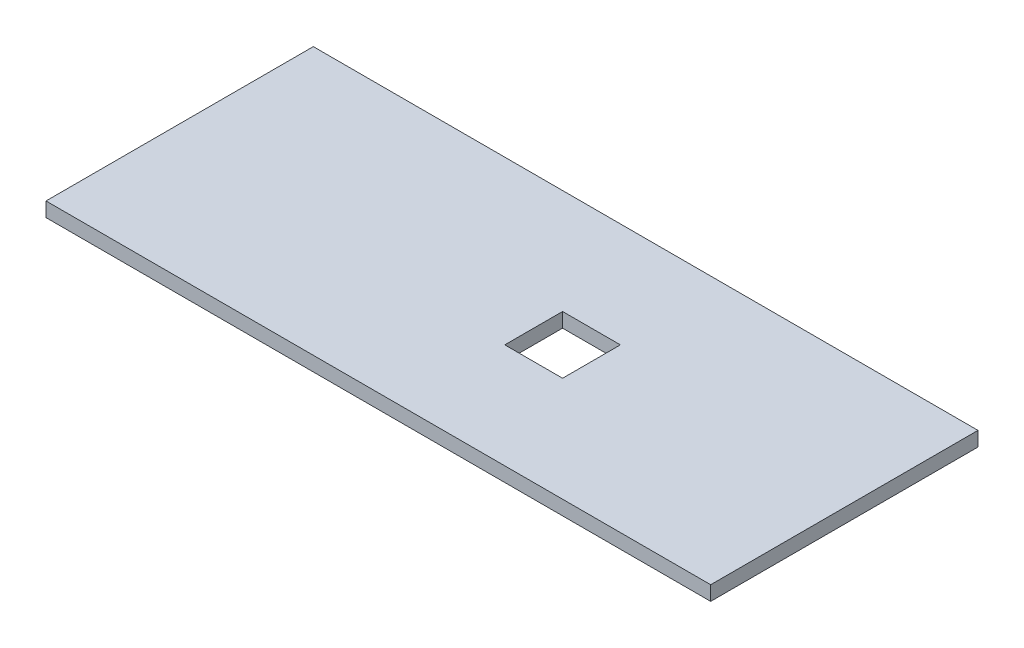
ISO-10303-21;
HEADER;
FILE_DESCRIPTION(('STEP AP214'),'2;1');
FILE_NAME('part.step','',(''),(''),'','','');
FILE_SCHEMA(('AUTOMOTIVE_DESIGN { 1 0 10303 214 1 1 1 1 }'));
ENDSEC;
DATA;
#1=APPLICATION_CONTEXT('core data for automotive mechanical design processes');
#2=APPLICATION_PROTOCOL_DEFINITION('international standard','automotive_design',2000,#1);
#3=PRODUCT_CONTEXT('',#1,'mechanical');
#4=PRODUCT('Part','Part','',(#3));
#5=PRODUCT_RELATED_PRODUCT_CATEGORY('part','',(#4));
#6=PRODUCT_DEFINITION_FORMATION('','',#4);
#7=PRODUCT_DEFINITION_CONTEXT('part definition',#1,'design');
#8=PRODUCT_DEFINITION('design','',#6,#7);
#9=PRODUCT_DEFINITION_SHAPE('','',#8);
#10=(LENGTH_UNIT() NAMED_UNIT(*) SI_UNIT(.MILLI.,.METRE.));
#11=(NAMED_UNIT(*) PLANE_ANGLE_UNIT() SI_UNIT($,.RADIAN.));
#12=(NAMED_UNIT(*) SI_UNIT($,.STERADIAN.) SOLID_ANGLE_UNIT());
#13=UNCERTAINTY_MEASURE_WITH_UNIT(LENGTH_MEASURE(1.E-05),#10,'distance_accuracy_value','');
#14=(GEOMETRIC_REPRESENTATION_CONTEXT(3) GLOBAL_UNCERTAINTY_ASSIGNED_CONTEXT((#13)) GLOBAL_UNIT_ASSIGNED_CONTEXT((#10,
#11,#12)) REPRESENTATION_CONTEXT('',''));
#15=CARTESIAN_POINT('',(0.,0.,0.));
#16=DIRECTION('',(0.,0.,1.));
#17=DIRECTION('',(1.,0.,0.));
#18=AXIS2_PLACEMENT_3D('',#15,#16,#17);
#19=CARTESIAN_POINT('',(0.,0.,74.));
#20=DIRECTION('',(0.,1.,0.));
#21=DIRECTION('',(-1.,0.,0.));
#22=AXIS2_PLACEMENT_3D('',#19,#20,#21);
#23=PLANE('',#22);
#24=DIRECTION('',(0.,0.,1.));
#25=VECTOR('',#24,1.);
#26=CARTESIAN_POINT('',(-86.,0.,74.));
#27=LINE('',#26,#25);
#28=CARTESIAN_POINT('',(-86.,0.,29.));
#29=VERTEX_POINT('',#28);
#30=CARTESIAN_POINT('',(-86.,0.,45.));
#31=VERTEX_POINT('',#30);
#32=EDGE_CURVE('E144',#29,#31,#27,.T.);
#33=ORIENTED_EDGE('',*,*,#32,.T.);
#34=DIRECTION('',(1.,0.,0.));
#35=VECTOR('',#34,1.);
#36=CARTESIAN_POINT('',(0.,0.,45.));
#37=LINE('',#36,#35);
#38=CARTESIAN_POINT('',(-70.,0.,45.));
#39=VERTEX_POINT('',#38);
#40=EDGE_CURVE('E148',#31,#39,#37,.T.);
#41=ORIENTED_EDGE('',*,*,#40,.T.);
#42=DIRECTION('',(0.,0.,-1.));
#43=VECTOR('',#42,1.);
#44=CARTESIAN_POINT('',(-70.,0.,74.));
#45=LINE('',#44,#43);
#46=CARTESIAN_POINT('',(-70.,0.,29.));
#47=VERTEX_POINT('',#46);
#48=EDGE_CURVE('E135',#39,#47,#45,.T.);
#49=ORIENTED_EDGE('',*,*,#48,.T.);
#50=DIRECTION('',(-1.,0.,0.));
#51=VECTOR('',#50,1.);
#52=CARTESIAN_POINT('',(0.,0.,29.));
#53=LINE('',#52,#51);
#54=EDGE_CURVE('E110',#47,#29,#53,.T.);
#55=ORIENTED_EDGE('',*,*,#54,.T.);
#56=EDGE_LOOP('',(#33,#41,#49,#55));
#57=FACE_BOUND('',#56,.T.);
#58=DIRECTION('',(1.,0.,0.));
#59=VECTOR('',#58,1.);
#60=CARTESIAN_POINT('',(0.,0.,0.));
#61=LINE('',#60,#59);
#62=CARTESIAN_POINT('',(-184.,0.,0.));
#63=VERTEX_POINT('',#62);
#64=CARTESIAN_POINT('',(0.,0.,0.));
#65=VERTEX_POINT('',#64);
#66=EDGE_CURVE('E152',#63,#65,#61,.T.);
#67=ORIENTED_EDGE('',*,*,#66,.T.);
#68=DIRECTION('',(0.,0.,-1.));
#69=VECTOR('',#68,1.);
#70=CARTESIAN_POINT('',(0.,0.,74.));
#71=LINE('',#70,#69);
#72=CARTESIAN_POINT('',(0.,0.,74.));
#73=VERTEX_POINT('',#72);
#74=EDGE_CURVE('E11',#73,#65,#71,.T.);
#75=ORIENTED_EDGE('',*,*,#74,.F.);
#76=DIRECTION('',(1.,0.,0.));
#77=VECTOR('',#76,1.);
#78=CARTESIAN_POINT('',(0.,0.,74.));
#79=LINE('',#78,#77);
#80=CARTESIAN_POINT('',(-184.,0.,74.));
#81=VERTEX_POINT('',#80);
#82=EDGE_CURVE('E153',#81,#73,#79,.T.);
#83=ORIENTED_EDGE('',*,*,#82,.F.);
#84=DIRECTION('',(0.,0.,-1.));
#85=VECTOR('',#84,1.);
#86=CARTESIAN_POINT('',(-184.,0.,74.));
#87=LINE('',#86,#85);
#88=EDGE_CURVE('E167',#81,#63,#87,.T.);
#89=ORIENTED_EDGE('',*,*,#88,.T.);
#90=EDGE_LOOP('',(#67,#75,#83,#89));
#91=FACE_BOUND('',#90,.T.);
#92=ADVANCED_FACE('F39',(#57,#91),#23,.F.);
#93=CARTESIAN_POINT('',(0.,0.,74.));
#94=DIRECTION('',(-1.,0.,0.));
#95=DIRECTION('',(0.,0.,1.));
#96=AXIS2_PLACEMENT_3D('',#93,#94,#95);
#97=PLANE('',#96);
#98=DIRECTION('',(0.,1.,0.));
#99=VECTOR('',#98,1.);
#100=CARTESIAN_POINT('',(0.,0.,0.));
#101=LINE('',#100,#99);
#102=CARTESIAN_POINT('',(0.,4.,0.));
#103=VERTEX_POINT('',#102);
#104=EDGE_CURVE('E171',#65,#103,#101,.T.);
#105=ORIENTED_EDGE('',*,*,#104,.T.);
#106=DIRECTION('',(0.,0.,-1.));
#107=VECTOR('',#106,1.);
#108=CARTESIAN_POINT('',(0.,4.,74.));
#109=LINE('',#108,#107);
#110=CARTESIAN_POINT('',(0.,4.,74.));
#111=VERTEX_POINT('',#110);
#112=EDGE_CURVE('E47',#111,#103,#109,.T.);
#113=ORIENTED_EDGE('',*,*,#112,.F.);
#114=DIRECTION('',(0.,1.,0.));
#115=VECTOR('',#114,1.);
#116=CARTESIAN_POINT('',(0.,0.,74.));
#117=LINE('',#116,#115);
#118=EDGE_CURVE('E157',#73,#111,#117,.T.);
#119=ORIENTED_EDGE('',*,*,#118,.F.);
#120=ORIENTED_EDGE('',*,*,#74,.T.);
#121=EDGE_LOOP('',(#105,#113,#119,#120));
#122=FACE_BOUND('',#121,.T.);
#123=ADVANCED_FACE('F205',(#122),#97,.F.);
#124=CARTESIAN_POINT('',(-184.,4.,74.));
#125=DIRECTION('',(0.,-1.,0.));
#126=DIRECTION('',(0.,0.,-1.));
#127=AXIS2_PLACEMENT_3D('',#124,#125,#126);
#128=PLANE('',#127);
#129=DIRECTION('',(0.,0.,-1.));
#130=VECTOR('',#129,1.);
#131=CARTESIAN_POINT('',(-70.,4.,37.));
#132=LINE('',#131,#130);
#133=CARTESIAN_POINT('',(-70.,4.,45.));
#134=VERTEX_POINT('',#133);
#135=CARTESIAN_POINT('',(-70.,4.,29.));
#136=VERTEX_POINT('',#135);
#137=EDGE_CURVE('E117',#134,#136,#132,.T.);
#138=ORIENTED_EDGE('',*,*,#137,.F.);
#139=DIRECTION('',(1.,0.,0.));
#140=VECTOR('',#139,1.);
#141=CARTESIAN_POINT('',(-86.,4.,45.));
#142=LINE('',#141,#140);
#143=CARTESIAN_POINT('',(-86.,4.,45.));
#144=VERTEX_POINT('',#143);
#145=EDGE_CURVE('E62',#144,#134,#142,.T.);
#146=ORIENTED_EDGE('',*,*,#145,.F.);
#147=DIRECTION('',(0.,0.,1.));
#148=VECTOR('',#147,1.);
#149=CARTESIAN_POINT('',(-86.,4.,29.));
#150=LINE('',#149,#148);
#151=CARTESIAN_POINT('',(-86.,4.,29.));
#152=VERTEX_POINT('',#151);
#153=EDGE_CURVE('E125',#152,#144,#150,.T.);
#154=ORIENTED_EDGE('',*,*,#153,.F.);
#155=DIRECTION('',(-1.,0.,0.));
#156=VECTOR('',#155,1.);
#157=CARTESIAN_POINT('',(-70.,4.,29.));
#158=LINE('',#157,#156);
#159=EDGE_CURVE('E107',#136,#152,#158,.T.);
#160=ORIENTED_EDGE('',*,*,#159,.F.);
#161=EDGE_LOOP('',(#138,#146,#154,#160));
#162=FACE_BOUND('',#161,.T.);
#163=DIRECTION('',(-1.,0.,0.));
#164=VECTOR('',#163,1.);
#165=CARTESIAN_POINT('',(-184.,4.,0.));
#166=LINE('',#165,#164);
#167=CARTESIAN_POINT('',(-184.,4.,0.));
#168=VERTEX_POINT('',#167);
#169=EDGE_CURVE('E174',#103,#168,#166,.T.);
#170=ORIENTED_EDGE('',*,*,#169,.T.);
#171=DIRECTION('',(0.,0.,-1.));
#172=VECTOR('',#171,1.);
#173=CARTESIAN_POINT('',(-184.,4.,74.));
#174=LINE('',#173,#172);
#175=CARTESIAN_POINT('',(-184.,4.,74.));
#176=VERTEX_POINT('',#175);
#177=EDGE_CURVE('E182',#176,#168,#174,.T.);
#178=ORIENTED_EDGE('',*,*,#177,.F.);
#179=DIRECTION('',(-1.,0.,0.));
#180=VECTOR('',#179,1.);
#181=CARTESIAN_POINT('',(-184.,4.,74.));
#182=LINE('',#181,#180);
#183=EDGE_CURVE('E161',#111,#176,#182,.T.);
#184=ORIENTED_EDGE('',*,*,#183,.F.);
#185=ORIENTED_EDGE('',*,*,#112,.T.);
#186=EDGE_LOOP('',(#170,#178,#184,#185));
#187=FACE_BOUND('',#186,.T.);
#188=ADVANCED_FACE('F122',(#162,#187),#128,.F.);
#189=CARTESIAN_POINT('',(-184.,0.,74.));
#190=DIRECTION('',(1.,0.,0.));
#191=DIRECTION('',(0.,0.,-1.));
#192=AXIS2_PLACEMENT_3D('',#189,#190,#191);
#193=PLANE('',#192);
#194=DIRECTION('',(0.,-1.,0.));
#195=VECTOR('',#194,1.);
#196=CARTESIAN_POINT('',(-184.,0.,0.));
#197=LINE('',#196,#195);
#198=EDGE_CURVE('E158',#168,#63,#197,.T.);
#199=ORIENTED_EDGE('',*,*,#198,.T.);
#200=ORIENTED_EDGE('',*,*,#88,.F.);
#201=DIRECTION('',(0.,-1.,0.));
#202=VECTOR('',#201,1.);
#203=CARTESIAN_POINT('',(-184.,0.,74.));
#204=LINE('',#203,#202);
#205=EDGE_CURVE('E164',#176,#81,#204,.T.);
#206=ORIENTED_EDGE('',*,*,#205,.F.);
#207=ORIENTED_EDGE('',*,*,#177,.T.);
#208=EDGE_LOOP('',(#199,#200,#206,#207));
#209=FACE_BOUND('',#208,.T.);
#210=ADVANCED_FACE('F198',(#209),#193,.F.);
#211=CARTESIAN_POINT('',(0.,0.,74.));
#212=DIRECTION('',(0.,0.,-1.));
#213=DIRECTION('',(-1.,0.,0.));
#214=AXIS2_PLACEMENT_3D('',#211,#212,#213);
#215=PLANE('',#214);
#216=ORIENTED_EDGE('',*,*,#82,.T.);
#217=ORIENTED_EDGE('',*,*,#118,.T.);
#218=ORIENTED_EDGE('',*,*,#183,.T.);
#219=ORIENTED_EDGE('',*,*,#205,.T.);
#220=EDGE_LOOP('',(#216,#217,#218,#219));
#221=FACE_BOUND('',#220,.T.);
#222=ADVANCED_FACE('F204',(#221),#215,.F.);
#223=CARTESIAN_POINT('',(0.,0.,0.));
#224=DIRECTION('',(0.,0.,-1.));
#225=DIRECTION('',(-1.,0.,0.));
#226=AXIS2_PLACEMENT_3D('',#223,#224,#225);
#227=PLANE('',#226);
#228=ORIENTED_EDGE('',*,*,#66,.F.);
#229=ORIENTED_EDGE('',*,*,#198,.F.);
#230=ORIENTED_EDGE('',*,*,#169,.F.);
#231=ORIENTED_EDGE('',*,*,#104,.F.);
#232=EDGE_LOOP('',(#228,#229,#230,#231));
#233=FACE_BOUND('',#232,.T.);
#234=ADVANCED_FACE('F195',(#233),#227,.T.);
#235=CARTESIAN_POINT('',(-86.,-70.,45.));
#236=DIRECTION('',(0.,0.,1.));
#237=DIRECTION('',(1.,0.,0.));
#238=AXIS2_PLACEMENT_3D('',#235,#236,#237);
#239=PLANE('',#238);
#240=DIRECTION('',(0.,1.,0.));
#241=VECTOR('',#240,1.);
#242=CARTESIAN_POINT('',(-86.,-70.,45.));
#243=LINE('',#242,#241);
#244=EDGE_CURVE('E132',#31,#144,#243,.T.);
#245=ORIENTED_EDGE('',*,*,#244,.T.);
#246=ORIENTED_EDGE('',*,*,#145,.T.);
#247=DIRECTION('',(0.,1.,0.));
#248=VECTOR('',#247,1.);
#249=CARTESIAN_POINT('',(-70.,-70.,45.));
#250=LINE('',#249,#248);
#251=EDGE_CURVE('E114',#39,#134,#250,.T.);
#252=ORIENTED_EDGE('',*,*,#251,.F.);
#253=ORIENTED_EDGE('',*,*,#40,.F.);
#254=EDGE_LOOP('',(#245,#246,#252,#253));
#255=FACE_BOUND('',#254,.T.);
#256=ADVANCED_FACE('F218',(#255),#239,.F.);
#257=CARTESIAN_POINT('',(-86.,-70.,29.));
#258=DIRECTION('',(-1.,0.,0.));
#259=DIRECTION('',(0.,0.,1.));
#260=AXIS2_PLACEMENT_3D('',#257,#258,#259);
#261=PLANE('',#260);
#262=DIRECTION('',(0.,1.,0.));
#263=VECTOR('',#262,1.);
#264=CARTESIAN_POINT('',(-86.,-70.,29.));
#265=LINE('',#264,#263);
#266=EDGE_CURVE('E113',#29,#152,#265,.T.);
#267=ORIENTED_EDGE('',*,*,#266,.T.);
#268=ORIENTED_EDGE('',*,*,#153,.T.);
#269=ORIENTED_EDGE('',*,*,#244,.F.);
#270=ORIENTED_EDGE('',*,*,#32,.F.);
#271=EDGE_LOOP('',(#267,#268,#269,#270));
#272=FACE_BOUND('',#271,.T.);
#273=ADVANCED_FACE('F223',(#272),#261,.F.);
#274=CARTESIAN_POINT('',(-70.,-70.,29.));
#275=DIRECTION('',(0.,0.,-1.));
#276=DIRECTION('',(-1.,0.,0.));
#277=AXIS2_PLACEMENT_3D('',#274,#275,#276);
#278=PLANE('',#277);
#279=DIRECTION('',(0.,1.,0.));
#280=VECTOR('',#279,1.);
#281=CARTESIAN_POINT('',(-70.,-70.,29.));
#282=LINE('',#281,#280);
#283=EDGE_CURVE('E54',#47,#136,#282,.T.);
#284=ORIENTED_EDGE('',*,*,#283,.T.);
#285=ORIENTED_EDGE('',*,*,#159,.T.);
#286=ORIENTED_EDGE('',*,*,#266,.F.);
#287=ORIENTED_EDGE('',*,*,#54,.F.);
#288=EDGE_LOOP('',(#284,#285,#286,#287));
#289=FACE_BOUND('',#288,.T.);
#290=ADVANCED_FACE('F104',(#289),#278,.F.);
#291=CARTESIAN_POINT('',(-70.,-70.,37.));
#292=DIRECTION('',(1.,0.,0.));
#293=DIRECTION('',(0.,0.,-1.));
#294=AXIS2_PLACEMENT_3D('',#291,#292,#293);
#295=PLANE('',#294);
#296=ORIENTED_EDGE('',*,*,#251,.T.);
#297=ORIENTED_EDGE('',*,*,#137,.T.);
#298=ORIENTED_EDGE('',*,*,#283,.F.);
#299=ORIENTED_EDGE('',*,*,#48,.F.);
#300=EDGE_LOOP('',(#296,#297,#298,#299));
#301=FACE_BOUND('',#300,.T.);
#302=ADVANCED_FACE('F118',(#301),#295,.F.);
#303=CLOSED_SHELL('',(#92,#123,#188,#210,#222,#234,#256,#273,#290,#302));
#304=MANIFOLD_SOLID_BREP('B2',#303);
#305=ADVANCED_BREP_SHAPE_REPRESENTATION('',(#18,#304),#14);
#306=SHAPE_DEFINITION_REPRESENTATION(#9,#305);
ENDSEC;
END-ISO-10303-21;
